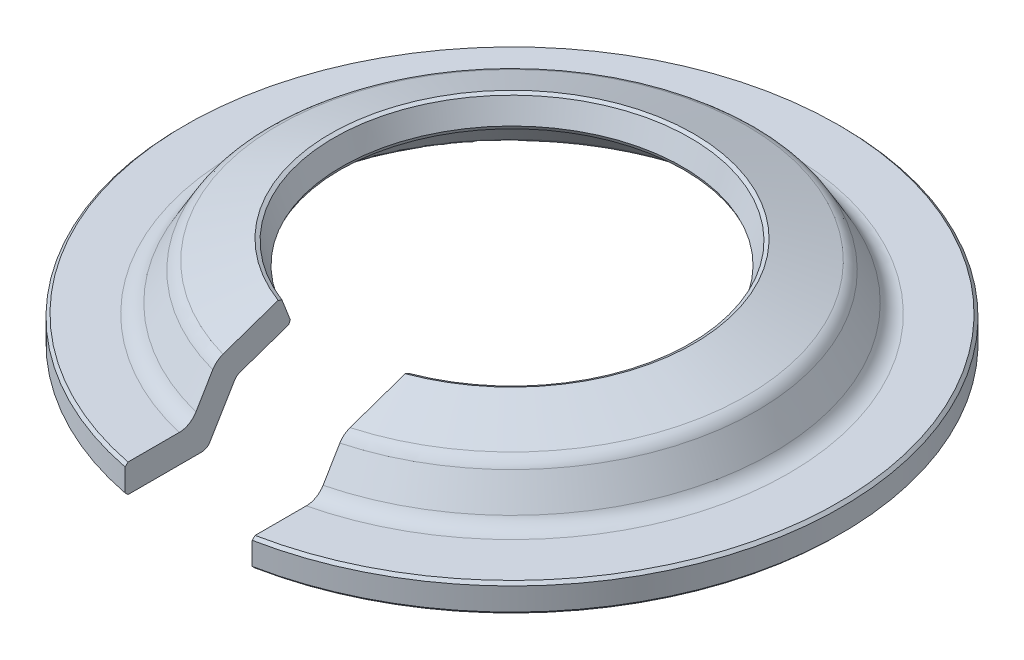
ISO-10303-21;
HEADER;
FILE_DESCRIPTION(('STEP AP214'),'2;1');
FILE_NAME('part.step','',(''),(''),'','','');
FILE_SCHEMA(('AUTOMOTIVE_DESIGN { 1 0 10303 214 1 1 1 1 }'));
ENDSEC;
DATA;
#1=APPLICATION_CONTEXT('core data for automotive mechanical design processes');
#2=APPLICATION_PROTOCOL_DEFINITION('international standard','automotive_design',2000,#1);
#3=PRODUCT_CONTEXT('',#1,'mechanical');
#4=PRODUCT('Part','Part','',(#3));
#5=PRODUCT_RELATED_PRODUCT_CATEGORY('part','',(#4));
#6=PRODUCT_DEFINITION_FORMATION('','',#4);
#7=PRODUCT_DEFINITION_CONTEXT('part definition',#1,'design');
#8=PRODUCT_DEFINITION('design','',#6,#7);
#9=PRODUCT_DEFINITION_SHAPE('','',#8);
#10=(LENGTH_UNIT() NAMED_UNIT(*) SI_UNIT(.MILLI.,.METRE.));
#11=(NAMED_UNIT(*) PLANE_ANGLE_UNIT() SI_UNIT($,.RADIAN.));
#12=(NAMED_UNIT(*) SI_UNIT($,.STERADIAN.) SOLID_ANGLE_UNIT());
#13=UNCERTAINTY_MEASURE_WITH_UNIT(LENGTH_MEASURE(1.E-05),#10,'distance_accuracy_value','');
#14=(GEOMETRIC_REPRESENTATION_CONTEXT(3) GLOBAL_UNCERTAINTY_ASSIGNED_CONTEXT((#13)) GLOBAL_UNIT_ASSIGNED_CONTEXT((#10,
#11,#12)) REPRESENTATION_CONTEXT('',''));
#15=CARTESIAN_POINT('',(0.,0.,0.));
#16=DIRECTION('',(0.,0.,1.));
#17=DIRECTION('',(1.,0.,0.));
#18=AXIS2_PLACEMENT_3D('',#15,#16,#17);
#19=CARTESIAN_POINT('',(0.,-2.92168390535543,0.));
#20=DIRECTION('',(0.,-1.,0.));
#21=DIRECTION('',(1.,0.,0.));
#22=AXIS2_PLACEMENT_3D('',#19,#20,#21);
#23=CONICAL_SURFACE('',#22,18.2819077862358,0.436332312998582);
#24=CARTESIAN_POINT('',(0.,-2.53717007612195,0.));
#25=DIRECTION('',(0.,1.,0.));
#26=DIRECTION('',(-1.,0.,0.));
#27=AXIS2_PLACEMENT_3D('',#24,#25,#26);
#28=CIRCLE('',#27,18.1026060429977);
#29=CARTESIAN_POINT('',(6.75,-2.53717007612196,16.7970784825212));
#30=VERTEX_POINT('',#29);
#31=CARTESIAN_POINT('',(-6.75,-2.53717007612196,16.7970784825212));
#32=VERTEX_POINT('',#31);
#33=EDGE_CURVE('E256',#30,#32,#28,.T.);
#34=ORIENTED_EDGE('',*,*,#33,.T.);
#35=CARTESIAN_POINT('',(-6.75,-2.92168390535543,16.9901633984029));
#36=CARTESIAN_POINT('',(-6.75,-2.85758811364505,16.9580027990364));
#37=CARTESIAN_POINT('',(-6.75,-2.793497398691,16.9258320896983));
#38=CARTESIAN_POINT('',(-6.75,-2.66532612227984,16.8614704510711));
#39=CARTESIAN_POINT('',(-6.75,-2.60124556082273,16.829279521782));
#40=CARTESIAN_POINT('',(-6.75,-2.53717007612196,16.7970784825212));
#41=B_SPLINE_CURVE_WITH_KNOTS('',3,(#35,#36,#37,#38,#39,#40),.UNSPECIFIED.,.F.,.F.,(4,2,4),(0.,
0.21513523315281,0.430270466358391),.UNSPECIFIED.);
#42=CARTESIAN_POINT('',(-6.75,-2.92168390535542,16.9901633984029));
#43=VERTEX_POINT('',#42);
#44=EDGE_CURVE('E445',#43,#32,#41,.T.);
#45=ORIENTED_EDGE('',*,*,#44,.F.);
#46=CARTESIAN_POINT('',(0.,-2.92168390535542,0.));
#47=DIRECTION('',(0.,-1.,0.));
#48=DIRECTION('',(1.,0.,0.));
#49=AXIS2_PLACEMENT_3D('',#46,#47,#48);
#50=CIRCLE('',#49,18.2819077862358);
#51=CARTESIAN_POINT('',(6.75,-2.92168390535542,16.9901633984029));
#52=VERTEX_POINT('',#51);
#53=EDGE_CURVE('E267',#43,#52,#50,.T.);
#54=ORIENTED_EDGE('',*,*,#53,.T.);
#55=CARTESIAN_POINT('',(6.75,-2.53717007612196,16.7970784825212));
#56=CARTESIAN_POINT('',(6.75,-2.60124556082273,16.829279521782));
#57=CARTESIAN_POINT('',(6.75,-2.66532612227984,16.8614704510711));
#58=CARTESIAN_POINT('',(6.75,-2.79349739869099,16.9258320896983));
#59=CARTESIAN_POINT('',(6.75,-2.85758811364504,16.9580027990364));
#60=CARTESIAN_POINT('',(6.75,-2.92168390535542,16.9901633984028));
#61=B_SPLINE_CURVE_WITH_KNOTS('',3,(#55,#56,#57,#58,#59,#60),.UNSPECIFIED.,.F.,.F.,(4,2,4),(0.,
0.215135233205581,0.430270466358389),.UNSPECIFIED.);
#62=EDGE_CURVE('E439',#30,#52,#61,.T.);
#63=ORIENTED_EDGE('',*,*,#62,.F.);
#64=EDGE_LOOP('',(#34,#45,#54,#63));
#65=FACE_BOUND('',#64,.T.);
#66=ADVANCED_FACE('F16',(#65),#23,.F.);
#67=CARTESIAN_POINT('',(0.,-0.102606042997707,0.));
#68=DIRECTION('',(0.,1.,0.));
#69=DIRECTION('',(-1.,0.,0.));
#70=AXIS2_PLACEMENT_3D('',#67,#68,#69);
#71=CONICAL_SURFACE('',#70,19.3079682162128,1.13446401379634);
#72=CARTESIAN_POINT('',(0.,-0.281907786235769,0.));
#73=DIRECTION('',(0.,1.,0.));
#74=DIRECTION('',(-1.,0.,0.));
#75=AXIS2_PLACEMENT_3D('',#72,#73,#74);
#76=CIRCLE('',#75,18.9234543869793);
#77=CARTESIAN_POINT('',(-6.75,-0.281907786235775,17.6786488719044));
#78=VERTEX_POINT('',#77);
#79=CARTESIAN_POINT('',(6.75,-0.28190778623577,17.6786488719044));
#80=VERTEX_POINT('',#79);
#81=EDGE_CURVE('E262',#78,#80,#76,.F.);
#82=ORIENTED_EDGE('',*,*,#81,.T.);
#83=CARTESIAN_POINT('',(6.75,-0.102606042997706,18.0896416945799));
#84=CARTESIAN_POINT('',(6.75,-0.132525640199931,18.0211585847581));
#85=CARTESIAN_POINT('',(6.75,-0.1624272507272,17.9526676279814));
#86=CARTESIAN_POINT('',(6.75,-0.222194498473271,17.8156700204229));
#87=CARTESIAN_POINT('',(6.75,-0.252060135692024,17.7471633696411));
#88=CARTESIAN_POINT('',(6.75,-0.28190778623577,17.6786488719044));
#89=B_SPLINE_CURVE_WITH_KNOTS('',3,(#83,#84,#85,#86,#87,#88),.UNSPECIFIED.,.F.,.F.,(4,2,4),(0.,
0.224200930530825,0.448401861372604),.UNSPECIFIED.);
#90=CARTESIAN_POINT('',(6.75,-0.102606042997706,18.0896416945799));
#91=VERTEX_POINT('',#90);
#92=EDGE_CURVE('E440',#91,#80,#89,.T.);
#93=ORIENTED_EDGE('',*,*,#92,.F.);
#94=CARTESIAN_POINT('',(0.,-0.102606042997707,0.));
#95=DIRECTION('',(0.,-1.,0.));
#96=DIRECTION('',(1.,0.,0.));
#97=AXIS2_PLACEMENT_3D('',#94,#95,#96);
#98=CIRCLE('',#97,19.3079682162128);
#99=CARTESIAN_POINT('',(-6.75,-0.102606042997707,18.0896416945799));
#100=VERTEX_POINT('',#99);
#101=EDGE_CURVE('E152',#100,#91,#98,.T.);
#102=ORIENTED_EDGE('',*,*,#101,.F.);
#103=CARTESIAN_POINT('',(-6.75,-0.281907786235773,17.6786488719044));
#104=CARTESIAN_POINT('',(-6.75,-0.252060135692027,17.7471633696411));
#105=CARTESIAN_POINT('',(-6.75,-0.222194498473273,17.8156700204229));
#106=CARTESIAN_POINT('',(-6.75,-0.1624272507272,17.9526676279814));
#107=CARTESIAN_POINT('',(-6.75,-0.132525640199931,18.0211585847581));
#108=CARTESIAN_POINT('',(-6.75,-0.102606042997705,18.0896416945799));
#109=B_SPLINE_CURVE_WITH_KNOTS('',3,(#103,#104,#105,#106,#107,#108),.UNSPECIFIED.,.F.,.F.,(4,2,
4),(0.,0.224200930841782,0.448401861372612),.UNSPECIFIED.);
#110=EDGE_CURVE('E159',#78,#100,#109,.T.);
#111=ORIENTED_EDGE('',*,*,#110,.F.);
#112=EDGE_LOOP('',(#82,#93,#102,#111));
#113=FACE_BOUND('',#112,.T.);
#114=ADVANCED_FACE('F444',(#113),#71,.F.);
#115=CARTESIAN_POINT('',(0.,-4.01024714877628,0.));
#116=DIRECTION('',(0.,-1.,0.));
#117=DIRECTION('',(1.,0.,0.));
#118=AXIS2_PLACEMENT_3D('',#115,#116,#117);
#119=TOROIDAL_SURFACE('',#118,24.1965151173459,2.);
#120=CARTESIAN_POINT('',(6.75,-2.13086190720442,23.9474327895783));
#121=CARTESIAN_POINT('',(6.75,-2.15042297384982,24.0032725243782));
#122=CARTESIAN_POINT('',(6.75,-2.17230916901002,24.0582752015728));
#123=CARTESIAN_POINT('',(6.75,-2.22062010324771,24.1662526078954));
#124=CARTESIAN_POINT('',(6.75,-2.24704507525911,24.2192272327713));
#125=CARTESIAN_POINT('',(6.75,-2.33126457768422,24.3715092192174));
#126=CARTESIAN_POINT('',(6.75,-2.39518098005349,24.4675132661546));
#127=CARTESIAN_POINT('',(6.75,-2.540949356121,24.6509846584302));
#128=CARTESIAN_POINT('',(6.75,-2.62339680538494,24.7379814105643));
#129=CARTESIAN_POINT('',(6.75,-2.75889023381161,24.8576912334467));
#130=CARTESIAN_POINT('',(6.75,-2.80684240492115,24.8962919717963));
#131=CARTESIAN_POINT('',(6.75,-2.90611009700667,24.9689238083279));
#132=CARTESIAN_POINT('',(6.75,-2.95742653131,25.0029536579005));
#133=CARTESIAN_POINT('',(6.75,-3.01024714877629,25.0345367626935));
#134=B_SPLINE_CURVE_WITH_KNOTS('',3,(#120,#121,#122,#123,#124,#125,#126,#127,#128,#129,#130,
#131,#132,#133),.UNSPECIFIED.,.F.,.F.,(4,2,2,2,2,2,4),(0.,0.177404837559576,0.35481878240877,
0.69916061706143,1.05675157378874,1.24119539362992,1.42568949515155),.UNSPECIFIED.);
#135=CARTESIAN_POINT('',(6.75,-2.13086190720441,23.9474327895783));
#136=VERTEX_POINT('',#135);
#137=CARTESIAN_POINT('',(6.75,-3.01024714877629,25.0345367626935));
#138=VERTEX_POINT('',#137);
#139=EDGE_CURVE('E442',#136,#138,#134,.T.);
#140=ORIENTED_EDGE('',*,*,#139,.T.);
#141=CARTESIAN_POINT('',(0.,-3.01024714877629,0.));
#142=DIRECTION('',(0.,-1.,0.));
#143=DIRECTION('',(1.,0.,0.));
#144=AXIS2_PLACEMENT_3D('',#141,#142,#143);
#145=CIRCLE('',#144,25.9285659249148);
#146=CARTESIAN_POINT('',(-6.75,-3.01024714877629,25.0345367626935));
#147=VERTEX_POINT('',#146);
#148=EDGE_CURVE('E138',#147,#138,#145,.T.);
#149=ORIENTED_EDGE('',*,*,#148,.F.);
#150=CARTESIAN_POINT('',(-6.75,-3.01024714877629,25.0345367626935));
#151=CARTESIAN_POINT('',(-6.75,-2.96045521374069,25.0047653702255));
#152=CARTESIAN_POINT('',(-6.75,-2.91199681648545,24.9728167446729));
#153=CARTESIAN_POINT('',(-6.75,-2.81805303975388,24.9048394822036));
#154=CARTESIAN_POINT('',(-6.75,-2.77256677143936,24.8688120739677));
#155=CARTESIAN_POINT('',(-6.75,-2.64351801992725,24.7571886505089));
#156=CARTESIAN_POINT('',(-6.75,-2.56445819213571,24.6762929343814));
#157=CARTESIAN_POINT('',(-6.75,-2.41505854845532,24.4957782463399));
#158=CARTESIAN_POINT('',(-6.75,-2.34588977726481,24.3951881874298));
#159=CARTESIAN_POINT('',(-6.75,-2.25511599147881,24.2349149023209));
#160=CARTESIAN_POINT('',(-6.75,-2.22668957950625,24.1789857034265));
#161=CARTESIAN_POINT('',(-6.75,-2.17492740264432,24.0648294546336));
#162=CARTESIAN_POINT('',(-6.75,-2.151590802735,24.0066027835057));
#163=CARTESIAN_POINT('',(-6.75,-2.13086190720447,23.9474327895785));
#164=B_SPLINE_CURVE_WITH_KNOTS('',3,(#150,#151,#152,#153,#154,#155,#156,#157,#158,#159,#160,
#161,#162,#163),.UNSPECIFIED.,.F.,.F.,(4,2,2,2,2,2,4),(0.,0.173932935881386,0.347813615422675,
0.685517542532046,1.04972063711903,1.23771970338331,1.42568790382199),.UNSPECIFIED.);
#165=CARTESIAN_POINT('',(-6.75,-2.13086190720447,23.9474327895785));
#166=VERTEX_POINT('',#165);
#167=EDGE_CURVE('E154',#147,#166,#164,.T.);
#168=ORIENTED_EDGE('',*,*,#167,.T.);
#169=CARTESIAN_POINT('',(0.,-2.13086190720441,0.));
#170=DIRECTION('',(0.,-1.,0.));
#171=DIRECTION('',(1.,0.,0.));
#172=AXIS2_PLACEMENT_3D('',#169,#170,#171);
#173=CIRCLE('',#172,24.8805554039971);
#174=EDGE_CURVE('E145',#136,#166,#173,.F.);
#175=ORIENTED_EDGE('',*,*,#174,.F.);
#176=EDGE_LOOP('',(#140,#149,#168,#175));
#177=FACE_BOUND('',#176,.T.);
#178=ADVANCED_FACE('F155',(#177),#119,.T.);
#179=CARTESIAN_POINT('',(0.,-7.30000000000001,0.));
#180=DIRECTION('',(0.,-1.,0.));
#181=DIRECTION('',(1.,0.,0.));
#182=AXIS2_PLACEMENT_3D('',#179,#180,#181);
#183=CONICAL_SURFACE('',#182,35.,0.785398163397463);
#184=CARTESIAN_POINT('',(6.75,-6.99999999999999,34.0371488230139));
#185=CARTESIAN_POINT('',(6.75,-7.04999572566279,34.0881181450103));
#186=CARTESIAN_POINT('',(6.75,-7.09999358849437,34.1390853703095));
#187=CARTESIAN_POINT('',(6.75,-7.19999358849438,34.2410156275129));
#188=CARTESIAN_POINT('',(6.75,-7.24999572566279,34.2919786594171));
#189=CARTESIAN_POINT('',(6.75,-7.30000000000001,34.3429395946241));
#190=B_SPLINE_CURVE_WITH_KNOTS('',3,(#184,#185,#186,#187,#188,#189),.UNSPECIFIED.,.F.,.F.,(4,2,
4),(0.,0.214189166583786,0.428378333164321),.UNSPECIFIED.);
#191=CARTESIAN_POINT('',(6.75,-7.,34.0371488230139));
#192=VERTEX_POINT('',#191);
#193=CARTESIAN_POINT('',(6.75,-7.30000000000001,34.3429395946241));
#194=VERTEX_POINT('',#193);
#195=EDGE_CURVE('E331',#192,#194,#190,.T.);
#196=ORIENTED_EDGE('',*,*,#195,.T.);
#197=CARTESIAN_POINT('',(0.,-7.30000000000001,0.));
#198=DIRECTION('',(0.,1.,0.));
#199=DIRECTION('',(-1.,0.,0.));
#200=AXIS2_PLACEMENT_3D('',#197,#198,#199);
#201=CIRCLE('',#200,35.);
#202=CARTESIAN_POINT('',(-6.75,-7.30000000000001,34.3429395946241));
#203=VERTEX_POINT('',#202);
#204=EDGE_CURVE('E283',#203,#194,#201,.F.);
#205=ORIENTED_EDGE('',*,*,#204,.F.);
#206=CARTESIAN_POINT('',(-6.75,-7.30000000000001,34.3429395946241));
#207=CARTESIAN_POINT('',(-6.75,-7.2499957256628,34.2919786594171));
#208=CARTESIAN_POINT('',(-6.75,-7.19999358849438,34.2410156275129));
#209=CARTESIAN_POINT('',(-6.75,-7.09999358849438,34.1390853703095));
#210=CARTESIAN_POINT('',(-6.75,-7.04999572566279,34.0881181450103));
#211=CARTESIAN_POINT('',(-6.75,-7.,34.0371488230139));
#212=B_SPLINE_CURVE_WITH_KNOTS('',3,(#206,#207,#208,#209,#210,#211),.UNSPECIFIED.,.F.,.F.,(4,2,
4),(0.,0.214189166580541,0.428378333164326),.UNSPECIFIED.);
#213=CARTESIAN_POINT('',(-6.75,-7.,34.0371488230139));
#214=VERTEX_POINT('',#213);
#215=EDGE_CURVE('E487',#203,#214,#212,.T.);
#216=ORIENTED_EDGE('',*,*,#215,.T.);
#217=CARTESIAN_POINT('',(0.,-6.99999999999999,0.));
#218=DIRECTION('',(0.,-1.,0.));
#219=DIRECTION('',(1.,0.,0.));
#220=AXIS2_PLACEMENT_3D('',#217,#218,#219);
#221=CIRCLE('',#220,34.7);
#222=EDGE_CURVE('E288',#192,#214,#221,.F.);
#223=ORIENTED_EDGE('',*,*,#222,.F.);
#224=EDGE_LOOP('',(#196,#205,#216,#223));
#225=FACE_BOUND('',#224,.T.);
#226=ADVANCED_FACE('F499',(#225),#183,.T.);
#227=CARTESIAN_POINT('',(0.,-5.64066208696809,0.));
#228=DIRECTION('',(0.,1.,0.));
#229=DIRECTION('',(-1.,0.,0.));
#230=AXIS2_PLACEMENT_3D('',#227,#228,#229);
#231=TOROIDAL_SURFACE('',#230,22.8284345440433,1.);
#232=CARTESIAN_POINT('',(0.,-5.14066208696808,0.));
#233=DIRECTION('',(0.,-1.,0.));
#234=DIRECTION('',(1.,0.,0.));
#235=AXIS2_PLACEMENT_3D('',#232,#233,#234);
#236=CIRCLE('',#235,23.6944599478277);
#237=CARTESIAN_POINT('',(-6.75,-5.14066208696808,22.7126601748719));
#238=VERTEX_POINT('',#237);
#239=CARTESIAN_POINT('',(6.75,-5.14066208696788,22.7126601748717));
#240=VERTEX_POINT('',#239);
#241=EDGE_CURVE('E282',#238,#240,#236,.T.);
#242=ORIENTED_EDGE('',*,*,#241,.T.);
#243=CARTESIAN_POINT('',(6.75,-4.70096946618218,22.1654566932291));
#244=CARTESIAN_POINT('',(6.75,-4.71064822215094,22.1932478915735));
#245=CARTESIAN_POINT('',(6.75,-4.72145922014062,22.2206261996323));
#246=CARTESIAN_POINT('',(6.75,-4.74531262101594,22.2744117224014));
#247=CARTESIAN_POINT('',(6.75,-4.75835633415282,22.3008183557734));
#248=CARTESIAN_POINT('',(6.75,-4.80065148074238,22.3781015783856));
#249=CARTESIAN_POINT('',(6.74999999999999,-4.83314727525229,22.4272727572958));
#250=CARTESIAN_POINT('',(6.75,-4.88804596630065,22.4967129353167));
#251=CARTESIAN_POINT('',(6.75,-4.9075767784168,22.5193243709025));
#252=CARTESIAN_POINT('',(6.75,-4.94853274770798,22.5627470001426));
#253=CARTESIAN_POINT('',(6.75,-4.9699565685565,22.5835594435444));
#254=CARTESIAN_POINT('',(6.75,-5.01523652861917,22.6238075640514));
#255=CARTESIAN_POINT('',(6.75,-5.03914668099694,22.6431824571738));
#256=CARTESIAN_POINT('',(6.75,-5.08867435648241,22.6796714915015));
#257=CARTESIAN_POINT('',(6.75,-5.11429374874147,22.6967830946243));
#258=CARTESIAN_POINT('',(6.75,-5.14066208696769,22.7126601748716));
#259=B_SPLINE_CURVE_WITH_KNOTS('',3,(#243,#244,#245,#246,#247,#248,#249,#250,#251,#252,#253,
#254,#255,#256,#257,#258),.UNSPECIFIED.,.F.,.F.,(4,2,2,2,2,2,2,4),(0.,0.0882242348074148,
0.176500421931855,0.352326946372852,0.441874418025405,0.531359173136113,0.623553968390467,
0.715851291004414),.UNSPECIFIED.);
#260=CARTESIAN_POINT('',(6.75,-4.70096946618218,22.1654566932291));
#261=VERTEX_POINT('',#260);
#262=EDGE_CURVE('E571',#261,#240,#259,.T.);
#263=ORIENTED_EDGE('',*,*,#262,.F.);
#264=CARTESIAN_POINT('',(0.,-4.70096946618218,0.));
#265=DIRECTION('',(0.,-1.,0.));
#266=DIRECTION('',(1.,0.,0.));
#267=AXIS2_PLACEMENT_3D('',#264,#265,#266);
#268=CIRCLE('',#267,23.1704546873689);
#269=CARTESIAN_POINT('',(-6.75,-4.70096946618218,22.1654566932291));
#270=VERTEX_POINT('',#269);
#271=EDGE_CURVE('E270',#261,#270,#268,.F.);
#272=ORIENTED_EDGE('',*,*,#271,.T.);
#273=CARTESIAN_POINT('',(-6.75,-5.14066208696809,22.7126601748719));
#274=CARTESIAN_POINT('',(-6.75000000000001,-5.09072299672193,22.6826301055278));
#275=CARTESIAN_POINT('',(-6.75,-5.04354944277696,22.6481629595235));
#276=CARTESIAN_POINT('',(-6.75,-4.95702818782974,22.5727289008418));
#277=CARTESIAN_POINT('',(-6.75,-4.91749816137198,22.5319713058848));
#278=CARTESIAN_POINT('',(-6.75,-4.84284133672069,22.4410824980994));
#279=CARTESIAN_POINT('',(-6.75,-4.80829946539549,22.3904678347504));
#280=CARTESIAN_POINT('',(-6.75,-4.76298324548775,22.3098836140767));
#281=CARTESIAN_POINT('',(-6.75,-4.74879582846418,22.2817750125294));
#282=CARTESIAN_POINT('',(-6.75,-4.72296263385826,22.2244191062634));
#283=CARTESIAN_POINT('',(-6.75,-4.71131637502655,22.1951720183919));
#284=CARTESIAN_POINT('',(-6.75,-4.70096946618218,22.1654566932291));
#285=B_SPLINE_CURVE_WITH_KNOTS('',3,(#273,#274,#275,#276,#277,#278,#279,#280,#281,#282,#283,
#284),.UNSPECIFIED.,.F.,.F.,(4,2,2,2,2,4),(0.,0.174457346403156,0.344023637901841,
0.526831726146514,0.621183928338796,0.715518246393087),.UNSPECIFIED.);
#286=EDGE_CURVE('E272',#238,#270,#285,.T.);
#287=ORIENTED_EDGE('',*,*,#286,.F.);
#288=EDGE_LOOP('',(#242,#263,#272,#287));
#289=FACE_BOUND('',#288,.T.);
#290=ADVANCED_FACE('F202',(#289),#231,.F.);
#291=CARTESIAN_POINT('',(0.,-4.70096946618218,0.));
#292=DIRECTION('',(0.,-1.,0.));
#293=DIRECTION('',(1.,0.,0.));
#294=AXIS2_PLACEMENT_3D('',#291,#292,#293);
#295=CONICAL_SURFACE('',#294,23.1704546873689,1.22173047639603);
#296=ORIENTED_EDGE('',*,*,#53,.F.);
#297=CARTESIAN_POINT('',(-6.75,-2.92168390535542,16.9901633984028));
#298=CARTESIAN_POINT('',(-6.75,-3.06782166476987,17.422169811963));
#299=CARTESIAN_POINT('',(-6.75,-3.21462230383447,17.8539513365048));
#300=CARTESIAN_POINT('',(-6.75,-3.50934799661913,18.717128231329));
#301=CARTESIAN_POINT('',(-6.75,-3.65727304490465,19.1485236034663));
#302=CARTESIAN_POINT('',(-6.75,-3.95404739555281,20.0109953163971));
#303=CARTESIAN_POINT('',(-6.75,-4.10289669647284,20.4420716576872));
#304=CARTESIAN_POINT('',(-6.75,-4.40137992723832,21.303954982834));
#305=CARTESIAN_POINT('',(-6.75,-4.55101386085839,21.7347619653836));
#306=CARTESIAN_POINT('',(-6.75,-4.70096946618218,22.1654566932291));
#307=B_SPLINE_CURVE_WITH_KNOTS('',3,(#297,#298,#299,#300,#301,#302,#303,#304,#305,#306),
.UNSPECIFIED.,.F.,.F.,(4,2,2,2,4),(0.,1.36816233692883,2.73631806540592,4.10447165896021,
5.47263184030041),.UNSPECIFIED.);
#308=EDGE_CURVE('E170',#43,#270,#307,.T.);
#309=ORIENTED_EDGE('',*,*,#308,.T.);
#310=ORIENTED_EDGE('',*,*,#271,.F.);
#311=CARTESIAN_POINT('',(6.75,-4.70096946618218,22.1654566932291));
#312=CARTESIAN_POINT('',(6.75,-4.55101386085839,21.7347619653836));
#313=CARTESIAN_POINT('',(6.75,-4.40137992723832,21.303954982834));
#314=CARTESIAN_POINT('',(6.75,-4.10289669647284,20.4420716576872));
#315=CARTESIAN_POINT('',(6.75,-3.95404739555281,20.0109953163971));
#316=CARTESIAN_POINT('',(6.75,-3.65727304490465,19.1485236034663));
#317=CARTESIAN_POINT('',(6.75,-3.50934799661913,18.717128231329));
#318=CARTESIAN_POINT('',(6.75,-3.21462230383447,17.8539513365048));
#319=CARTESIAN_POINT('',(6.75,-3.06782166476986,17.422169811963));
#320=CARTESIAN_POINT('',(6.75,-2.92168390535542,16.9901633984028));
#321=B_SPLINE_CURVE_WITH_KNOTS('',3,(#311,#312,#313,#314,#315,#316,#317,#318,#319,#320),
.UNSPECIFIED.,.F.,.F.,(4,2,2,2,4),(0.,1.3681601813402,2.73631377489449,4.10446950337159,
5.47263184030042),.UNSPECIFIED.);
#322=EDGE_CURVE('E355',#261,#52,#321,.T.);
#323=ORIENTED_EDGE('',*,*,#322,.T.);
#324=EDGE_LOOP('',(#296,#309,#310,#323));
#325=FACE_BOUND('',#324,.T.);
#326=ADVANCED_FACE('F423',(#325),#295,.F.);
#327=CARTESIAN_POINT('',(0.,-0.281907786235763,0.));
#328=DIRECTION('',(0.,1.,0.));
#329=DIRECTION('',(-1.,0.,0.));
#330=AXIS2_PLACEMENT_3D('',#327,#328,#329);
#331=CONICAL_SURFACE('',#330,18.9234543869793,0.349065850398868);
#332=ORIENTED_EDGE('',*,*,#33,.F.);
#333=CARTESIAN_POINT('',(6.75,-2.53717007612196,16.7970784825212));
#334=CARTESIAN_POINT('',(6.75,-2.16146247737456,16.9444403803649));
#335=CARTESIAN_POINT('',(6.75,-1.78567015245754,17.091585528942));
#336=CARTESIAN_POINT('',(6.75,-1.03391605582632,17.3854423253966));
#337=CARTESIAN_POINT('',(6.75,-0.657954284114607,17.5321539732806));
#338=CARTESIAN_POINT('',(6.75,-0.281907786235769,17.6786488719044));
#339=B_SPLINE_CURVE_WITH_KNOTS('',3,(#333,#334,#335,#336,#337,#338),.UNSPECIFIED.,.F.,.F.,(4,2,
4),(0.,1.21072048630013,2.42144095474895),.UNSPECIFIED.);
#340=EDGE_CURVE('E411',#30,#80,#339,.T.);
#341=ORIENTED_EDGE('',*,*,#340,.T.);
#342=ORIENTED_EDGE('',*,*,#81,.F.);
#343=CARTESIAN_POINT('',(-6.75,-0.281907786235774,17.6786488719044));
#344=CARTESIAN_POINT('',(-6.75,-0.657954284114611,17.5321539732806));
#345=CARTESIAN_POINT('',(-6.75,-1.03391605582632,17.3854423253966));
#346=CARTESIAN_POINT('',(-6.75,-1.78567015245755,17.091585528942));
#347=CARTESIAN_POINT('',(-6.75,-2.16146247737457,16.9444403803649));
#348=CARTESIAN_POINT('',(-6.75,-2.53717007612196,16.7970784825212));
#349=B_SPLINE_CURVE_WITH_KNOTS('',3,(#343,#344,#345,#346,#347,#348),.UNSPECIFIED.,.F.,.F.,(4,2,
4),(0.,1.21072046844882,2.42144095474895),.UNSPECIFIED.);
#350=EDGE_CURVE('E166',#78,#32,#349,.T.);
#351=ORIENTED_EDGE('',*,*,#350,.T.);
#352=EDGE_LOOP('',(#332,#341,#342,#351));
#353=FACE_BOUND('',#352,.T.);
#354=ADVANCED_FACE('F419',(#353),#331,.F.);
#355=CARTESIAN_POINT('',(0.,-2.13086190720441,0.));
#356=DIRECTION('',(0.,-1.,0.));
#357=DIRECTION('',(1.,0.,0.));
#358=AXIS2_PLACEMENT_3D('',#355,#356,#357);
#359=CONICAL_SURFACE('',#358,24.8805554039971,1.22173047639603);
#360=CARTESIAN_POINT('',(6.75,-0.102606042997705,18.0896416945799));
#361=CARTESIAN_POINT('',(6.75,-0.269347813161207,18.5785778291052));
#362=CARTESIAN_POINT('',(6.75,-0.436806249840506,19.0672688506558));
#363=CARTESIAN_POINT('',(6.75,-0.772926681278855,20.0442346114073));
#364=CARTESIAN_POINT('',(6.75,-0.941588670948489,20.5325093523588));
#365=CARTESIAN_POINT('',(6.75,-1.27988760011422,21.5087199154778));
#366=CARTESIAN_POINT('',(6.75,-1.44952453818902,21.9966557381382));
#367=CARTESIAN_POINT('',(6.75,-1.78961789434256,22.9722440620792));
#368=CARTESIAN_POINT('',(6.75,-1.96007431586831,23.4598965621583));
#369=CARTESIAN_POINT('',(6.75,-2.13086190720442,23.9474327895783));
#370=B_SPLINE_CURVE_WITH_KNOTS('',3,(#360,#361,#362,#363,#364,#365,#366,#367,#368,#369),
.UNSPECIFIED.,.F.,.F.,(4,2,2,2,4),(0.,1.54975725661771,3.09950796371936,4.64925641213566,
6.19901138501316),.UNSPECIFIED.);
#371=EDGE_CURVE('E151',#91,#136,#370,.T.);
#372=ORIENTED_EDGE('',*,*,#371,.T.);
#373=ORIENTED_EDGE('',*,*,#174,.T.);
#374=CARTESIAN_POINT('',(-6.75,-2.13086190720447,23.9474327895785));
#375=CARTESIAN_POINT('',(-6.75,-1.96007431586836,23.4598965621584));
#376=CARTESIAN_POINT('',(-6.75,-1.7896178943426,22.9722440620793));
#377=CARTESIAN_POINT('',(-6.75,-1.44952453818905,21.9966557381383));
#378=CARTESIAN_POINT('',(-6.75,-1.27988760011425,21.5087199154779));
#379=CARTESIAN_POINT('',(-6.75,-0.94158867094851,20.5325093523588));
#380=CARTESIAN_POINT('',(-6.75,-0.77292668127887,20.0442346114074));
#381=CARTESIAN_POINT('',(-6.75,-0.436806249840514,19.0672688506558));
#382=CARTESIAN_POINT('',(-6.75,-0.269347813161211,18.5785778291052));
#383=CARTESIAN_POINT('',(-6.75,-0.102606042997709,18.0896416945799));
#384=B_SPLINE_CURVE_WITH_KNOTS('',3,(#374,#375,#376,#377,#378,#379,#380,#381,#382,#383),
.UNSPECIFIED.,.F.,.F.,(4,2,2,2,4),(0.,1.54975497287753,3.09950342129387,4.64925412839556,
6.1990113850133),.UNSPECIFIED.);
#385=EDGE_CURVE('E149',#166,#100,#384,.T.);
#386=ORIENTED_EDGE('',*,*,#385,.T.);
#387=ORIENTED_EDGE('',*,*,#101,.T.);
#388=EDGE_LOOP('',(#372,#373,#386,#387));
#389=FACE_BOUND('',#388,.T.);
#390=ADVANCED_FACE('F146',(#389),#359,.T.);
#391=CARTESIAN_POINT('',(0.,-6.,0.));
#392=DIRECTION('',(0.,-1.,0.));
#393=DIRECTION('',(1.,0.,0.));
#394=AXIS2_PLACEMENT_3D('',#391,#392,#393);
#395=CONICAL_SURFACE('',#394,27.6547005383793,0.523598775598295);
#396=CARTESIAN_POINT('',(6.75,-3.01024714877629,25.0345367626935));
#397=CARTESIAN_POINT('',(6.75,-3.50825335220232,25.3323060161244));
#398=CARTESIAN_POINT('',(6.75,-4.00640252670802,25.6298356336091));
#399=CARTESIAN_POINT('',(6.75,-5.00298681045352,26.2244155922558));
#400=CARTESIAN_POINT('',(6.75,-5.50142191968906,26.521465933425));
#401=CARTESIAN_POINT('',(6.75,-6.,26.8182766386551));
#402=B_SPLINE_CURVE_WITH_KNOTS('',3,(#396,#397,#398,#399,#400,#401),.UNSPECIFIED.,.F.,.F.,(4,2,
4),(0.,1.74071487041142,3.48142971488379),.UNSPECIFIED.);
#403=CARTESIAN_POINT('',(6.75,-6.,26.8182766386551));
#404=VERTEX_POINT('',#403);
#405=EDGE_CURVE('E334',#138,#404,#402,.T.);
#406=ORIENTED_EDGE('',*,*,#405,.T.);
#407=CARTESIAN_POINT('',(0.,-6.,0.));
#408=DIRECTION('',(0.,1.,0.));
#409=DIRECTION('',(-1.,0.,0.));
#410=AXIS2_PLACEMENT_3D('',#407,#408,#409);
#411=CIRCLE('',#410,27.6547005383793);
#412=CARTESIAN_POINT('',(-6.75000000000001,-6.,26.8182766386551));
#413=VERTEX_POINT('',#412);
#414=EDGE_CURVE('E247',#404,#413,#411,.T.);
#415=ORIENTED_EDGE('',*,*,#414,.T.);
#416=CARTESIAN_POINT('',(-6.75,-6.,26.8182766386551));
#417=CARTESIAN_POINT('',(-6.75,-5.50142191968906,26.521465933425));
#418=CARTESIAN_POINT('',(-6.75,-5.00298681045352,26.2244155922558));
#419=CARTESIAN_POINT('',(-6.75,-4.00640252670802,25.6298356336091));
#420=CARTESIAN_POINT('',(-6.75,-3.50825335220232,25.3323060161244));
#421=CARTESIAN_POINT('',(-6.75,-3.01024714877629,25.0345367626935));
#422=B_SPLINE_CURVE_WITH_KNOTS('',3,(#416,#417,#418,#419,#420,#421),.UNSPECIFIED.,.F.,.F.,(4,2,
4),(0.,1.74071484447237,3.48142971488379),.UNSPECIFIED.);
#423=EDGE_CURVE('E167',#413,#147,#422,.T.);
#424=ORIENTED_EDGE('',*,*,#423,.T.);
#425=ORIENTED_EDGE('',*,*,#148,.T.);
#426=EDGE_LOOP('',(#406,#415,#424,#425));
#427=FACE_BOUND('',#426,.T.);
#428=ADVANCED_FACE('F234',(#427),#395,.T.);
#429=CARTESIAN_POINT('',(0.,-5.,0.));
#430=DIRECTION('',(0.,1.,0.));
#431=DIRECTION('',(-1.,0.,0.));
#432=AXIS2_PLACEMENT_3D('',#429,#430,#431);
#433=TOROIDAL_SURFACE('',#432,29.3867513459481,2.);
#434=ORIENTED_EDGE('',*,*,#414,.F.);
#435=CARTESIAN_POINT('',(6.75,-6.,26.8182766386551));
#436=CARTESIAN_POINT('',(6.75,-6.04921050291816,26.8475747201888));
#437=CARTESIAN_POINT('',(6.75,-6.09712771855213,26.878984748664));
#438=CARTESIAN_POINT('',(6.75,-6.19008928778102,26.9457833818252));
#439=CARTESIAN_POINT('',(6.75,-6.23513423321489,26.9811711627055));
#440=CARTESIAN_POINT('',(6.75,-6.36523090615662,27.0926697763629));
#441=CARTESIAN_POINT('',(6.75,-6.44562237044671,27.1743421577463));
#442=CARTESIAN_POINT('',(6.75,-6.59164081680801,27.3498526273946));
#443=CARTESIAN_POINT('',(6.75,-6.6572680164542,27.4436905363489));
#444=CARTESIAN_POINT('',(6.75,-6.77229872132833,27.6410045287924));
#445=CARTESIAN_POINT('',(6.75,-6.8216877533716,27.7444891055605));
#446=CARTESIAN_POINT('',(6.75,-6.88502100469665,27.9108793885007));
#447=CARTESIAN_POINT('',(6.75,-6.90499305592989,27.9715664579411));
#448=CARTESIAN_POINT('',(6.75,-6.93935190520796,28.0945274906601));
#449=CARTESIAN_POINT('',(6.75,-6.95373790732604,28.1568016787328));
#450=CARTESIAN_POINT('',(6.75,-6.97681700064319,28.2824726590115));
#451=CARTESIAN_POINT('',(6.75,-6.98550291272121,28.3458707640022));
#452=CARTESIAN_POINT('',(6.75,-6.99709731647214,28.4731868024547));
#453=CARTESIAN_POINT('',(6.75,-7.00000636503803,28.5371046852132));
#454=CARTESIAN_POINT('',(6.75,-7.,28.6010254128866));
#455=B_SPLINE_CURVE_WITH_KNOTS('',3,(#435,#436,#437,#438,#439,#440,#441,#442,#443,#444,#445,
#446,#447,#448,#449,#450,#451,#452,#453,#454),.UNSPECIFIED.,.F.,.F.,(4,2,2,2,2,2,2,2,2,4),(0.,
0.171702183461054,0.343368872131217,0.68539803332356,1.02742215384078,1.36975030143674,
1.56119189789288,1.75266076185464,1.94437031559519,2.13606138752662),.UNSPECIFIED.);
#456=CARTESIAN_POINT('',(6.75,-7.,28.6010254128866));
#457=VERTEX_POINT('',#456);
#458=EDGE_CURVE('E330',#404,#457,#455,.T.);
#459=ORIENTED_EDGE('',*,*,#458,.T.);
#460=CARTESIAN_POINT('',(0.,-7.,0.));
#461=DIRECTION('',(0.,1.,0.));
#462=DIRECTION('',(0.229695345379873,0.,0.973262579323186));
#463=AXIS2_PLACEMENT_3D('',#460,#461,#462);
#464=CIRCLE('',#463,29.3867513459481);
#465=CARTESIAN_POINT('',(29.3867513459481,-7.,0.));
#466=VERTEX_POINT('',#465);
#467=EDGE_CURVE('E216',#466,#457,#464,.F.);
#468=ORIENTED_EDGE('',*,*,#467,.F.);
#469=CARTESIAN_POINT('',(0.,-7.,0.));
#470=DIRECTION('',(0.,1.,0.));
#471=DIRECTION('',(1.,0.,0.));
#472=AXIS2_PLACEMENT_3D('',#469,#470,#471);
#473=CIRCLE('',#472,29.3867513459481);
#474=CARTESIAN_POINT('',(-29.3867513459481,-7.,0.));
#475=VERTEX_POINT('',#474);
#476=EDGE_CURVE('E313',#475,#466,#473,.F.);
#477=ORIENTED_EDGE('',*,*,#476,.F.);
#478=CARTESIAN_POINT('',(0.,-7.,0.));
#479=DIRECTION('',(0.,1.,0.));
#480=DIRECTION('',(-1.,0.,0.));
#481=AXIS2_PLACEMENT_3D('',#478,#479,#480);
#482=CIRCLE('',#481,29.3867513459481);
#483=CARTESIAN_POINT('',(-6.75,-7.,28.6010254128866));
#484=VERTEX_POINT('',#483);
#485=EDGE_CURVE('E249',#484,#475,#482,.F.);
#486=ORIENTED_EDGE('',*,*,#485,.F.);
#487=CARTESIAN_POINT('',(-6.75,-7.,28.6010254128866));
#488=CARTESIAN_POINT('',(-6.75,-6.99999842276884,28.54186812666));
#489=CARTESIAN_POINT('',(-6.75,-6.99751218618459,28.482739729118));
#490=CARTESIAN_POINT('',(-6.75,-6.98759245561886,28.3649001204559));
#491=CARTESIAN_POINT('',(-6.75,-6.98015901263593,28.3061889050416));
#492=CARTESIAN_POINT('',(-6.75,-6.95049632454853,28.1313682129427));
#493=CARTESIAN_POINT('',(-6.75,-6.92090458670528,28.0164177944736));
#494=CARTESIAN_POINT('',(-6.75,-6.84280668277914,27.7930799583723));
#495=CARTESIAN_POINT('',(-6.75,-6.79428190070057,27.6846991218626));
#496=CARTESIAN_POINT('',(-6.75,-6.67949982699684,27.4777464446213));
#497=CARTESIAN_POINT('',(-6.75000000000001,-6.61325361879416,27.3791685255806));
#498=CARTESIAN_POINT('',(-6.75000000000001,-6.50161159745584,27.2405563979103));
#499=CARTESIAN_POINT('',(-6.75,-6.46209545155678,27.1956697488742));
#500=CARTESIAN_POINT('',(-6.75,-6.37925981007644,27.1095309439762));
#501=CARTESIAN_POINT('',(-6.75,-6.33594038972744,27.0682787162545));
#502=CARTESIAN_POINT('',(-6.75,-6.24567637299832,26.9896612604003));
#503=CARTESIAN_POINT('',(-6.75,-6.19872108416009,26.9523083189716));
#504=CARTESIAN_POINT('',(-6.75,-6.10164472085515,26.8819486821334));
#505=CARTESIAN_POINT('',(-6.75,-6.05152293614667,26.8489429669602));
#506=CARTESIAN_POINT('',(-6.75,-6.,26.8182766386551));
#507=B_SPLINE_CURVE_WITH_KNOTS('',3,(#487,#488,#489,#490,#491,#492,#493,#494,#495,#496,#497,
#498,#499,#500,#501,#502,#503,#504,#505,#506),.UNSPECIFIED.,.F.,.F.,(4,2,2,2,2,2,2,2,2,4),(0.,
0.177362230892259,0.354722633464632,0.708987558246083,1.0636016969045,1.4179945674584,
1.59721170487013,1.77642529800017,1.95618755382212,2.1359902742791),.UNSPECIFIED.);
#508=EDGE_CURVE('E172',#484,#413,#507,.T.);
#509=ORIENTED_EDGE('',*,*,#508,.T.);
#510=EDGE_LOOP('',(#434,#459,#468,#477,#486,#509));
#511=FACE_BOUND('',#510,.T.);
#512=ADVANCED_FACE('F223',(#511),#433,.F.);
#513=CARTESIAN_POINT('',(-28.2320508075689,-7.,0.));
#514=DIRECTION('',(0.,1.,0.));
#515=DIRECTION('',(-1.,0.,0.));
#516=AXIS2_PLACEMENT_3D('',#513,#514,#515);
#517=PLANE('',#516);
#518=DIRECTION('',(0.,0.,-1.));
#519=VECTOR('',#518,1.);
#520=CARTESIAN_POINT('',(6.75,-7.,8.));
#521=LINE('',#520,#519);
#522=EDGE_CURVE('E323',#457,#192,#521,.F.);
#523=ORIENTED_EDGE('',*,*,#522,.T.);
#524=ORIENTED_EDGE('',*,*,#222,.T.);
#525=DIRECTION('',(0.,0.,1.));
#526=VECTOR('',#525,1.);
#527=CARTESIAN_POINT('',(-6.75,-7.,8.));
#528=LINE('',#527,#526);
#529=EDGE_CURVE('E281',#214,#484,#528,.F.);
#530=ORIENTED_EDGE('',*,*,#529,.T.);
#531=ORIENTED_EDGE('',*,*,#485,.T.);
#532=ORIENTED_EDGE('',*,*,#476,.T.);
#533=ORIENTED_EDGE('',*,*,#467,.T.);
#534=EDGE_LOOP('',(#523,#524,#530,#531,#532,#533));
#535=FACE_BOUND('',#534,.T.);
#536=ADVANCED_FACE('F233',(#535),#517,.T.);
#537=CARTESIAN_POINT('',(0.,0.,0.));
#538=DIRECTION('',(0.,1.,0.));
#539=DIRECTION('',(-1.,0.,0.));
#540=AXIS2_PLACEMENT_3D('',#537,#538,#539);
#541=CYLINDRICAL_SURFACE('',#540,35.);
#542=ORIENTED_EDGE('',*,*,#204,.T.);
#543=DIRECTION('',(0.,1.,0.));
#544=VECTOR('',#543,1.);
#545=CARTESIAN_POINT('',(6.75,-10.,34.3429395946241));
#546=LINE('',#545,#544);
#547=CARTESIAN_POINT('',(6.75,-9.7,34.3429395946241));
#548=VERTEX_POINT('',#547);
#549=EDGE_CURVE('E296',#194,#548,#546,.F.);
#550=ORIENTED_EDGE('',*,*,#549,.T.);
#551=CARTESIAN_POINT('',(0.,-9.7,0.));
#552=DIRECTION('',(0.,1.,0.));
#553=DIRECTION('',(-1.,0.,0.));
#554=AXIS2_PLACEMENT_3D('',#551,#552,#553);
#555=CIRCLE('',#554,35.);
#556=CARTESIAN_POINT('',(-6.75,-9.7,34.3429395946241));
#557=VERTEX_POINT('',#556);
#558=EDGE_CURVE('E345',#557,#548,#555,.F.);
#559=ORIENTED_EDGE('',*,*,#558,.F.);
#560=DIRECTION('',(0.,1.,0.));
#561=VECTOR('',#560,1.);
#562=CARTESIAN_POINT('',(-6.75,-10.,34.3429395946241));
#563=LINE('',#562,#561);
#564=EDGE_CURVE('E279',#557,#203,#563,.T.);
#565=ORIENTED_EDGE('',*,*,#564,.T.);
#566=EDGE_LOOP('',(#542,#550,#559,#565));
#567=FACE_BOUND('',#566,.T.);
#568=ADVANCED_FACE('F614',(#567),#541,.T.);
#569=CARTESIAN_POINT('',(0.,-9.50000000000001,0.));
#570=DIRECTION('',(0.,-1.,0.));
#571=DIRECTION('',(1.,0.,0.));
#572=AXIS2_PLACEMENT_3D('',#569,#570,#571);
#573=CONICAL_SURFACE('',#572,26.2113248654052,0.523598775598296);
#574=ORIENTED_EDGE('',*,*,#241,.F.);
#575=CARTESIAN_POINT('',(-6.75,-5.14066208696809,22.7126601748719));
#576=CARTESIAN_POINT('',(-6.75,-5.503534849938,22.9312203838451));
#577=CARTESIAN_POINT('',(-6.75,-5.86652008545687,23.1495937914032));
#578=CARTESIAN_POINT('',(-6.75,-6.5926982718205,23.5859943357864));
#579=CARTESIAN_POINT('',(-6.75,-6.95589122250372,23.8040214728802));
#580=CARTESIAN_POINT('',(-6.75,-7.68246813345271,24.2397571240427));
#581=CARTESIAN_POINT('',(-6.75,-8.0458520936976,24.4574656381462));
#582=CARTESIAN_POINT('',(-6.75,-8.77279698213118,24.8925876591657));
#583=CARTESIAN_POINT('',(-6.75,-9.13635791045705,25.1100011658524));
#584=CARTESIAN_POINT('',(-6.75,-9.50000000000001,25.3272787957927));
#585=B_SPLINE_CURVE_WITH_KNOTS('',3,(#575,#576,#577,#578,#579,#580,#581,#582,#583,#584),
.UNSPECIFIED.,.F.,.F.,(4,2,2,2,4),(0.,1.27082909894666,2.5416572108561,3.81248518388449,
5.08331414367492),.UNSPECIFIED.);
#586=CARTESIAN_POINT('',(-6.75,-9.5,25.3272787957927));
#587=VERTEX_POINT('',#586);
#588=EDGE_CURVE('E357',#238,#587,#585,.T.);
#589=ORIENTED_EDGE('',*,*,#588,.T.);
#590=CARTESIAN_POINT('',(0.,-9.5,0.));
#591=DIRECTION('',(0.,-1.,0.));
#592=DIRECTION('',(1.,0.,0.));
#593=AXIS2_PLACEMENT_3D('',#590,#591,#592);
#594=CIRCLE('',#593,26.2113248654052);
#595=CARTESIAN_POINT('',(6.75,-9.5,25.3272787957927));
#596=VERTEX_POINT('',#595);
#597=EDGE_CURVE('E556',#596,#587,#594,.F.);
#598=ORIENTED_EDGE('',*,*,#597,.F.);
#599=CARTESIAN_POINT('',(6.75,-9.5,25.3272787957927));
#600=CARTESIAN_POINT('',(6.75,-9.13635791045701,25.1100011658524));
#601=CARTESIAN_POINT('',(6.75,-8.77279698213111,24.8925876591656));
#602=CARTESIAN_POINT('',(6.75,-8.04585209369747,24.4574656381461));
#603=CARTESIAN_POINT('',(6.75,-7.68246813345254,24.2397571240426));
#604=CARTESIAN_POINT('',(6.75,-6.95589122250349,23.80402147288));
#605=CARTESIAN_POINT('',(6.75,-6.59269827182024,23.5859943357862));
#606=CARTESIAN_POINT('',(6.75,-5.86652008545654,23.1495937914031));
#607=CARTESIAN_POINT('',(6.75,-5.50353484993764,22.9312203838449));
#608=CARTESIAN_POINT('',(6.75,-5.14066208696769,22.7126601748716));
#609=B_SPLINE_CURVE_WITH_KNOTS('',3,(#599,#600,#601,#602,#603,#604,#605,#606,#607,#608),
.UNSPECIFIED.,.F.,.F.,(4,2,2,2,4),(0.,1.27082895979054,2.54165693281904,3.8124850447286,
5.08331414367538),.UNSPECIFIED.);
#610=EDGE_CURVE('E347',#596,#240,#609,.T.);
#611=ORIENTED_EDGE('',*,*,#610,.T.);
#612=EDGE_LOOP('',(#574,#589,#598,#611));
#613=FACE_BOUND('',#612,.T.);
#614=ADVANCED_FACE('F573',(#613),#573,.F.);
#615=CARTESIAN_POINT('',(-6.75,-10.,8.));
#616=DIRECTION('',(-1.,0.,0.));
#617=DIRECTION('',(0.,0.,1.));
#618=AXIS2_PLACEMENT_3D('',#615,#616,#617);
#619=PLANE('',#618);
#620=ORIENTED_EDGE('',*,*,#588,.F.);
#621=ORIENTED_EDGE('',*,*,#286,.T.);
#622=ORIENTED_EDGE('',*,*,#308,.F.);
#623=ORIENTED_EDGE('',*,*,#44,.T.);
#624=ORIENTED_EDGE('',*,*,#350,.F.);
#625=ORIENTED_EDGE('',*,*,#110,.T.);
#626=ORIENTED_EDGE('',*,*,#385,.F.);
#627=ORIENTED_EDGE('',*,*,#167,.F.);
#628=ORIENTED_EDGE('',*,*,#423,.F.);
#629=ORIENTED_EDGE('',*,*,#508,.F.);
#630=ORIENTED_EDGE('',*,*,#529,.F.);
#631=ORIENTED_EDGE('',*,*,#215,.F.);
#632=ORIENTED_EDGE('',*,*,#564,.F.);
#633=CARTESIAN_POINT('',(-6.75,-10.,34.0371488230139));
#634=CARTESIAN_POINT('',(-6.75,-9.95000427433722,34.0881181450103));
#635=CARTESIAN_POINT('',(-6.75,-9.90000641150563,34.1390853703095));
#636=CARTESIAN_POINT('',(-6.75,-9.80000641150563,34.2410156275129));
#637=CARTESIAN_POINT('',(-6.75,-9.75000427433722,34.2919786594171));
#638=CARTESIAN_POINT('',(-6.75,-9.7,34.3429395946241));
#639=B_SPLINE_CURVE_WITH_KNOTS('',3,(#633,#634,#635,#636,#637,#638),.UNSPECIFIED.,.F.,.F.,(4,2,
4),(0.,0.214189166583771,0.428378333164304),.UNSPECIFIED.);
#640=CARTESIAN_POINT('',(-6.75,-10.,34.0371488230139));
#641=VERTEX_POINT('',#640);
#642=EDGE_CURVE('E348',#641,#557,#639,.T.);
#643=ORIENTED_EDGE('',*,*,#642,.F.);
#644=DIRECTION('',(0.,0.,1.));
#645=VECTOR('',#644,1.);
#646=CARTESIAN_POINT('',(-6.75,-10.,0.));
#647=LINE('',#646,#645);
#648=CARTESIAN_POINT('',(-6.75000000000001,-10.,26.2225169959023));
#649=VERTEX_POINT('',#648);
#650=EDGE_CURVE('E548',#649,#641,#647,.T.);
#651=ORIENTED_EDGE('',*,*,#650,.F.);
#652=CARTESIAN_POINT('',(-6.75,-9.5,25.3272787957927));
#653=CARTESIAN_POINT('',(-6.75000000000001,-9.5246218576909,25.3419902324266));
#654=CARTESIAN_POINT('',(-6.75000000000001,-9.54859248854798,25.3577617554126));
#655=CARTESIAN_POINT('',(-6.75,-9.59508810779293,25.3912984267581));
#656=CARTESIAN_POINT('',(-6.74999999999999,-9.61761342206862,25.4090631231993));
#657=CARTESIAN_POINT('',(-6.75000000000002,-9.68264882990031,25.4650181144408));
#658=CARTESIAN_POINT('',(-6.7500000000001,-9.72281781119826,25.505989207061));
#659=CARTESIAN_POINT('',(-6.74999999999989,-9.79575736885136,25.5940078939847));
#660=CARTESIAN_POINT('',(-6.74999999999961,-9.82852879400645,25.6410547901719));
#661=CARTESIAN_POINT('',(-6.75000000000039,-9.88596305228385,25.7399098397685));
#662=CARTESIAN_POINT('',(-6.75000000000146,-9.91061763883985,25.7917227674446));
#663=CARTESIAN_POINT('',(-6.75000000000156,-9.95371676577491,25.9052834017691));
#664=CARTESIAN_POINT('',(-6.75000000000031,-9.97102537682858,25.9674694155934));
#665=CARTESIAN_POINT('',(-6.74999999999985,-9.98838385835713,26.0622723418636));
#666=CARTESIAN_POINT('',(-6.74999999999992,-9.99273597990971,26.0941621480254));
#667=CARTESIAN_POINT('',(-6.75000000000008,-9.99854317743203,26.1582006372241));
#668=CARTESIAN_POINT('',(-6.75000000000016,-9.99999860863395,26.1903492880324));
#669=CARTESIAN_POINT('',(-6.75,-10.,26.2225169959023));
#670=B_SPLINE_CURVE_WITH_KNOTS('',3,(#652,#653,#654,#655,#656,#657,#658,#659,#660,#661,#662,
#663,#664,#665,#666,#667,#668,#669),.UNSPECIFIED.,.F.,.F.,(4,2,2,2,2,2,2,2,4),(0.,
0.0859899448640436,0.171960432211608,0.3432124683341,0.514444844898156,0.68585065752218,
0.878326737750203,0.974770831455578,1.07120309712479),.UNSPECIFIED.);
#671=EDGE_CURVE('E550',#587,#649,#670,.T.);
#672=ORIENTED_EDGE('',*,*,#671,.F.);
#673=EDGE_LOOP('',(#620,#621,#622,#623,#624,#625,#626,#627,#628,#629,#630,#631,#632,#643,#651,#672));
#674=FACE_BOUND('',#673,.T.);
#675=ADVANCED_FACE('F163',(#674),#619,.F.);
#676=CARTESIAN_POINT('',(0.,-9.7,0.));
#677=DIRECTION('',(0.,1.,0.));
#678=DIRECTION('',(-1.,0.,0.));
#679=AXIS2_PLACEMENT_3D('',#676,#677,#678);
#680=CONICAL_SURFACE('',#679,35.,0.785398163397457);
#681=ORIENTED_EDGE('',*,*,#558,.T.);
#682=CARTESIAN_POINT('',(6.75,-9.7,34.3429395946241));
#683=CARTESIAN_POINT('',(6.75,-9.75000427433721,34.2919786594171));
#684=CARTESIAN_POINT('',(6.75,-9.80000641150563,34.2410156275129));
#685=CARTESIAN_POINT('',(6.75,-9.90000641150563,34.1390853703095));
#686=CARTESIAN_POINT('',(6.75,-9.95000427433721,34.0881181450103));
#687=CARTESIAN_POINT('',(6.75,-10.,34.0371488230139));
#688=B_SPLINE_CURVE_WITH_KNOTS('',3,(#682,#683,#684,#685,#686,#687),.UNSPECIFIED.,.F.,.F.,(4,2,
4),(0.,0.214189166580535,0.42837833316431),.UNSPECIFIED.);
#689=CARTESIAN_POINT('',(6.75,-10.,34.0371488230139));
#690=VERTEX_POINT('',#689);
#691=EDGE_CURVE('E333',#548,#690,#688,.T.);
#692=ORIENTED_EDGE('',*,*,#691,.T.);
#693=CARTESIAN_POINT('',(0.,-10.,0.));
#694=DIRECTION('',(0.,1.,0.));
#695=DIRECTION('',(-1.,0.,0.));
#696=AXIS2_PLACEMENT_3D('',#693,#694,#695);
#697=CIRCLE('',#696,34.7);
#698=EDGE_CURVE('E553',#641,#690,#697,.F.);
#699=ORIENTED_EDGE('',*,*,#698,.F.);
#700=ORIENTED_EDGE('',*,*,#642,.T.);
#701=EDGE_LOOP('',(#681,#692,#699,#700));
#702=FACE_BOUND('',#701,.T.);
#703=ADVANCED_FACE('F375',(#702),#680,.T.);
#704=CARTESIAN_POINT('',(6.75,-10.,8.));
#705=DIRECTION('',(1.,0.,0.));
#706=DIRECTION('',(0.,0.,-1.));
#707=AXIS2_PLACEMENT_3D('',#704,#705,#706);
#708=PLANE('',#707);
#709=DIRECTION('',(0.,0.,1.));
#710=VECTOR('',#709,1.);
#711=CARTESIAN_POINT('',(6.75000000000001,-10.,0.));
#712=LINE('',#711,#710);
#713=CARTESIAN_POINT('',(6.75,-10.,26.2225169959023));
#714=VERTEX_POINT('',#713);
#715=EDGE_CURVE('E570',#690,#714,#712,.F.);
#716=ORIENTED_EDGE('',*,*,#715,.F.);
#717=ORIENTED_EDGE('',*,*,#691,.F.);
#718=ORIENTED_EDGE('',*,*,#549,.F.);
#719=ORIENTED_EDGE('',*,*,#195,.F.);
#720=ORIENTED_EDGE('',*,*,#522,.F.);
#721=ORIENTED_EDGE('',*,*,#458,.F.);
#722=ORIENTED_EDGE('',*,*,#405,.F.);
#723=ORIENTED_EDGE('',*,*,#139,.F.);
#724=ORIENTED_EDGE('',*,*,#371,.F.);
#725=ORIENTED_EDGE('',*,*,#92,.T.);
#726=ORIENTED_EDGE('',*,*,#340,.F.);
#727=ORIENTED_EDGE('',*,*,#62,.T.);
#728=ORIENTED_EDGE('',*,*,#322,.F.);
#729=ORIENTED_EDGE('',*,*,#262,.T.);
#730=ORIENTED_EDGE('',*,*,#610,.F.);
#731=CARTESIAN_POINT('',(6.75,-10.,26.2225169959023));
#732=CARTESIAN_POINT('',(6.75,-10.0000399788627,26.1629121103217));
#733=CARTESIAN_POINT('',(6.75,-9.99500386621257,26.1033133376024));
#734=CARTESIAN_POINT('',(6.75,-9.97508208108259,25.985793143239));
#735=CARTESIAN_POINT('',(6.75,-9.96019774888181,25.9278714944686));
#736=CARTESIAN_POINT('',(6.75,-9.92086090182057,25.8152931857205));
#737=CARTESIAN_POINT('',(6.75,-9.89639813750031,25.7606400957399));
#738=CARTESIAN_POINT('',(6.75000000000001,-9.83854242017168,25.6563424887221));
#739=CARTESIAN_POINT('',(6.75000000000001,-9.80515649221709,25.6066940737539));
#740=CARTESIAN_POINT('',(6.75000000000001,-9.73041943109799,25.5140947931921));
#741=CARTESIAN_POINT('',(6.75,-9.68910267407614,25.4711164199052));
#742=CARTESIAN_POINT('',(6.75,-9.62193629957492,25.4125514483065));
#743=CARTESIAN_POINT('',(6.75,-9.59862949910955,25.3939817932876));
#744=CARTESIAN_POINT('',(6.75,-9.55044984809516,25.3589861735338));
#745=CARTESIAN_POINT('',(6.75000000000001,-9.52557660122063,25.3425607545671));
#746=CARTESIAN_POINT('',(6.75000000000001,-9.5,25.3272787957927));
#747=B_SPLINE_CURVE_WITH_KNOTS('',3,(#731,#732,#733,#734,#735,#736,#737,#738,#739,#740,#741,
#742,#743,#744,#745,#746),.UNSPECIFIED.,.F.,.F.,(4,2,2,2,2,2,2,4),(0.,0.178595224317744,
0.357166147977609,0.535928677050624,0.714550881901205,0.892415653377885,0.981712553767416,
1.07103213858361),.UNSPECIFIED.);
#748=EDGE_CURVE('E387',#714,#596,#747,.T.);
#749=ORIENTED_EDGE('',*,*,#748,.F.);
#750=EDGE_LOOP('',(#716,#717,#718,#719,#720,#721,#722,#723,#724,#725,#726,#727,#728,#729,#730,#749));
#751=FACE_BOUND('',#750,.T.);
#752=ADVANCED_FACE('F328',(#751),#708,.F.);
#753=CARTESIAN_POINT('',(0.,-9.00000000000001,0.));
#754=DIRECTION('',(0.,-1.,0.));
#755=DIRECTION('',(1.,0.,0.));
#756=AXIS2_PLACEMENT_3D('',#753,#754,#755);
#757=TOROIDAL_SURFACE('',#756,27.0773502691896,1.);
#758=ORIENTED_EDGE('',*,*,#597,.T.);
#759=ORIENTED_EDGE('',*,*,#671,.T.);
#760=CARTESIAN_POINT('',(0.,-10.,0.));
#761=DIRECTION('',(0.,-1.,0.));
#762=DIRECTION('',(-0.249285839747791,0.,0.968429951055438));
#763=AXIS2_PLACEMENT_3D('',#760,#761,#762);
#764=CIRCLE('',#763,27.0773502691896);
#765=CARTESIAN_POINT('',(-27.0773502691896,-10.,0.));
#766=VERTEX_POINT('',#765);
#767=EDGE_CURVE('E11',#766,#649,#764,.F.);
#768=ORIENTED_EDGE('',*,*,#767,.F.);
#769=CARTESIAN_POINT('',(0.,-10.,0.));
#770=DIRECTION('',(0.,-1.,0.));
#771=DIRECTION('',(-1.,0.,0.));
#772=AXIS2_PLACEMENT_3D('',#769,#770,#771);
#773=CIRCLE('',#772,27.0773502691896);
#774=CARTESIAN_POINT('',(27.0773502691896,-10.,0.));
#775=VERTEX_POINT('',#774);
#776=EDGE_CURVE('E28',#775,#766,#773,.F.);
#777=ORIENTED_EDGE('',*,*,#776,.F.);
#778=CARTESIAN_POINT('',(0.,-10.,0.));
#779=DIRECTION('',(0.,-1.,0.));
#780=DIRECTION('',(1.,0.,0.));
#781=AXIS2_PLACEMENT_3D('',#778,#779,#780);
#782=CIRCLE('',#781,27.0773502691896);
#783=EDGE_CURVE('E566',#714,#775,#782,.F.);
#784=ORIENTED_EDGE('',*,*,#783,.F.);
#785=ORIENTED_EDGE('',*,*,#748,.T.);
#786=EDGE_LOOP('',(#758,#759,#768,#777,#784,#785));
#787=FACE_BOUND('',#786,.T.);
#788=ADVANCED_FACE('F510',(#787),#757,.T.);
#789=CARTESIAN_POINT('',(-35.,-10.,0.));
#790=DIRECTION('',(0.,-1.,0.));
#791=DIRECTION('',(1.,0.,0.));
#792=AXIS2_PLACEMENT_3D('',#789,#790,#791);
#793=PLANE('',#792);
#794=ORIENTED_EDGE('',*,*,#776,.T.);
#795=ORIENTED_EDGE('',*,*,#767,.T.);
#796=ORIENTED_EDGE('',*,*,#650,.T.);
#797=ORIENTED_EDGE('',*,*,#698,.T.);
#798=ORIENTED_EDGE('',*,*,#715,.T.);
#799=ORIENTED_EDGE('',*,*,#783,.T.);
#800=EDGE_LOOP('',(#794,#795,#796,#797,#798,#799));
#801=FACE_BOUND('',#800,.T.);
#802=ADVANCED_FACE('F508',(#801),#793,.T.);
#803=CLOSED_SHELL('',(#66,#114,#178,#226,#290,#326,#354,#390,#428,#512,#536,#568,#614,#675,#703,
#752,#788,#802));
#804=MANIFOLD_SOLID_BREP('B1',#803);
#805=ADVANCED_BREP_SHAPE_REPRESENTATION('',(#18,#804),#14);
#806=SHAPE_DEFINITION_REPRESENTATION(#9,#805);
ENDSEC;
END-ISO-10303-21;
